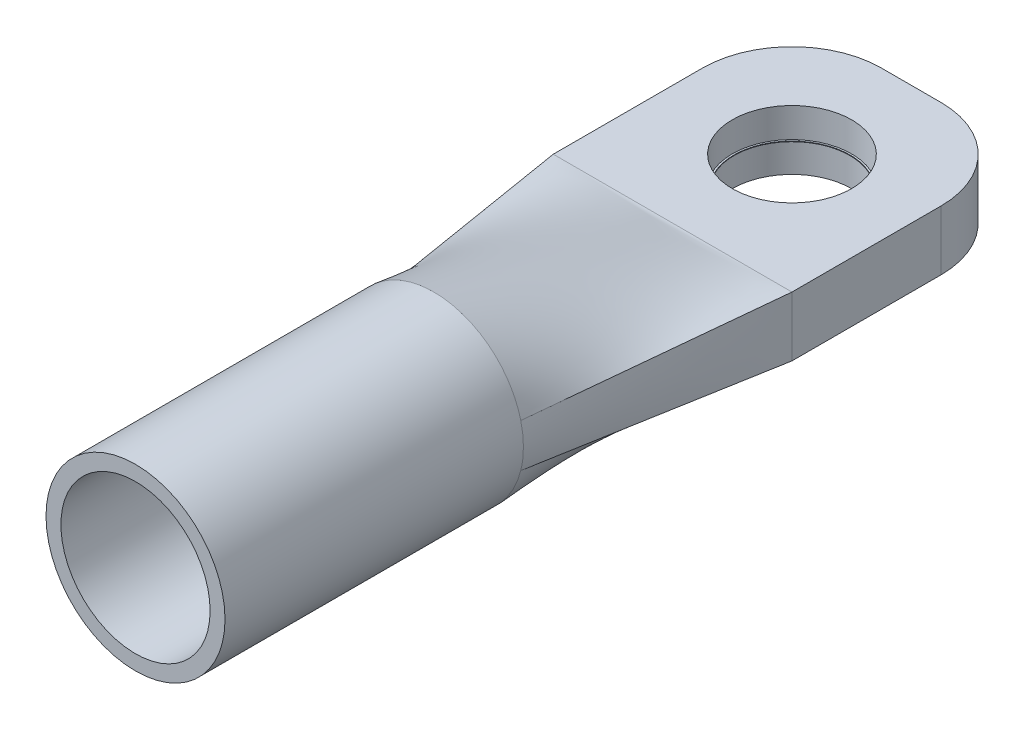
ISO-10303-21;
HEADER;
FILE_DESCRIPTION(('STEP AP214'),'2;1');
FILE_NAME('part.step','',(''),(''),'','','');
FILE_SCHEMA(('AUTOMOTIVE_DESIGN { 1 0 10303 214 1 1 1 1 }'));
ENDSEC;
DATA;
#1=APPLICATION_CONTEXT('core data for automotive mechanical design processes');
#2=APPLICATION_PROTOCOL_DEFINITION('international standard','automotive_design',2000,#1);
#3=PRODUCT_CONTEXT('',#1,'mechanical');
#4=PRODUCT('Part','Part','',(#3));
#5=PRODUCT_RELATED_PRODUCT_CATEGORY('part','',(#4));
#6=PRODUCT_DEFINITION_FORMATION('','',#4);
#7=PRODUCT_DEFINITION_CONTEXT('part definition',#1,'design');
#8=PRODUCT_DEFINITION('design','',#6,#7);
#9=PRODUCT_DEFINITION_SHAPE('','',#8);
#10=(LENGTH_UNIT() NAMED_UNIT(*) SI_UNIT(.MILLI.,.METRE.));
#11=(NAMED_UNIT(*) PLANE_ANGLE_UNIT() SI_UNIT($,.RADIAN.));
#12=(NAMED_UNIT(*) SI_UNIT($,.STERADIAN.) SOLID_ANGLE_UNIT());
#13=UNCERTAINTY_MEASURE_WITH_UNIT(LENGTH_MEASURE(1.E-05),#10,'distance_accuracy_value','');
#14=(GEOMETRIC_REPRESENTATION_CONTEXT(3) GLOBAL_UNCERTAINTY_ASSIGNED_CONTEXT((#13)) GLOBAL_UNIT_ASSIGNED_CONTEXT((#10,
#11,#12)) REPRESENTATION_CONTEXT('',''));
#15=CARTESIAN_POINT('',(0.,0.,0.));
#16=DIRECTION('',(0.,0.,1.));
#17=DIRECTION('',(1.,0.,0.));
#18=AXIS2_PLACEMENT_3D('',#15,#16,#17);
#19=CARTESIAN_POINT('',(0.,-11.,-12.));
#20=DIRECTION('',(0.,1.,0.));
#21=DIRECTION('',(-1.,0.,0.));
#22=AXIS2_PLACEMENT_3D('',#19,#20,#21);
#23=CYLINDRICAL_SURFACE('',#22,2.);
#24=CARTESIAN_POINT('',(0.,-0.999999999999999,-12.));
#25=DIRECTION('',(0.,1.,0.));
#26=DIRECTION('',(-1.,0.,0.));
#27=AXIS2_PLACEMENT_3D('',#24,#25,#26);
#28=CIRCLE('',#27,2.);
#29=CARTESIAN_POINT('',(-2.,-0.999999999999999,-12.));
#30=VERTEX_POINT('',#29);
#31=EDGE_CURVE('E414',#30,#30,#28,.T.);
#32=ORIENTED_EDGE('',*,*,#31,.F.);
#33=EDGE_LOOP('',(#32));
#34=FACE_BOUND('',#33,.T.);
#35=CARTESIAN_POINT('',(0.,-0.00999999999999959,-12.));
#36=DIRECTION('',(0.,1.,0.));
#37=DIRECTION('',(0.,0.,1.));
#38=AXIS2_PLACEMENT_3D('',#35,#36,#37);
#39=CIRCLE('',#38,2.);
#40=CARTESIAN_POINT('',(0.,-0.00999999999999959,-10.));
#41=VERTEX_POINT('',#40);
#42=EDGE_CURVE('E12',#41,#41,#39,.F.);
#43=ORIENTED_EDGE('',*,*,#42,.F.);
#44=EDGE_LOOP('',(#43));
#45=FACE_BOUND('',#44,.T.);
#46=ADVANCED_FACE('F64',(#34,#45),#23,.F.);
#47=CARTESIAN_POINT('',(0.,0.,10.));
#48=DIRECTION('',(0.,0.,1.));
#49=DIRECTION('',(1.,0.,0.));
#50=AXIS2_PLACEMENT_3D('',#47,#48,#49);
#51=PLANE('',#50);
#52=CARTESIAN_POINT('',(0.,0.,10.));
#53=DIRECTION('',(0.,0.,1.));
#54=DIRECTION('',(1.,0.,0.));
#55=AXIS2_PLACEMENT_3D('',#52,#53,#54);
#56=CIRCLE('',#55,3.);
#57=CARTESIAN_POINT('',(3.,0.,10.));
#58=VERTEX_POINT('',#57);
#59=EDGE_CURVE('E303',#58,#58,#56,.T.);
#60=ORIENTED_EDGE('',*,*,#59,.T.);
#61=EDGE_LOOP('',(#60));
#62=FACE_BOUND('',#61,.T.);
#63=CARTESIAN_POINT('',(0.,0.,10.));
#64=DIRECTION('',(0.,0.,1.));
#65=DIRECTION('',(1.,0.,0.));
#66=AXIS2_PLACEMENT_3D('',#63,#64,#65);
#67=CIRCLE('',#66,2.5);
#68=CARTESIAN_POINT('',(2.5,0.,10.));
#69=VERTEX_POINT('',#68);
#70=EDGE_CURVE('E304',#69,#69,#67,.T.);
#71=ORIENTED_EDGE('',*,*,#70,.F.);
#72=EDGE_LOOP('',(#71));
#73=FACE_BOUND('',#72,.T.);
#74=ADVANCED_FACE('F321',(#62,#73),#51,.T.);
#75=CARTESIAN_POINT('',(0.,0.,10.));
#76=DIRECTION('',(0.,0.,-1.));
#77=DIRECTION('',(-1.,0.,0.));
#78=AXIS2_PLACEMENT_3D('',#75,#76,#77);
#79=CYLINDRICAL_SURFACE('',#78,3.);
#80=ORIENTED_EDGE('',*,*,#59,.F.);
#81=EDGE_LOOP('',(#80));
#82=FACE_BOUND('',#81,.T.);
#83=CARTESIAN_POINT('',(-2.910427500436,0.727606875108999,0.));
#84=CARTESIAN_POINT('',(-2.85160397102423,0.962900992756057,0.));
#85=CARTESIAN_POINT('',(-2.75857854698862,1.21439415370098,0.));
#86=CARTESIAN_POINT('',(-2.47409174507778,1.72144671639495,0.));
#87=CARTESIAN_POINT('',(-2.28172040904308,1.97699530056574,0.));
#88=CARTESIAN_POINT('',(-1.7834014666696,2.43602907457679,0.));
#89=CARTESIAN_POINT('',(-1.47663557905439,2.6383647433975,0.));
#90=CARTESIAN_POINT('',(-0.77972465175108,2.92120704846197,0.));
#91=CARTESIAN_POINT('',(-0.390388203202208,3.,0.));
#92=CARTESIAN_POINT('',(0.390388203202207,3.,0.));
#93=CARTESIAN_POINT('',(0.779724651751079,2.92120704846197,0.));
#94=CARTESIAN_POINT('',(1.47663557905439,2.6383647433975,0.));
#95=CARTESIAN_POINT('',(1.7834014666696,2.43602907457679,0.));
#96=CARTESIAN_POINT('',(2.28172040904308,1.97699530056574,0.));
#97=CARTESIAN_POINT('',(2.47409174507778,1.72144671639495,0.));
#98=CARTESIAN_POINT('',(2.75857854698862,1.21439415370098,0.));
#99=CARTESIAN_POINT('',(2.85160397102423,0.962900992756059,0.));
#100=CARTESIAN_POINT('',(2.910427500436,0.727606875109,0.));
#101=B_SPLINE_CURVE_WITH_KNOTS('',3,(#83,#84,#85,#86,#87,#88,#89,#90,#91,#92,#93,#94,#95,#96,
#97,#98,#99,#100),.UNSPECIFIED.,.F.,.F.,(4,2,2,2,2,2,2,2,4),(0.,0.125,0.25,0.375,0.5,0.625,0.75,
0.875,1.),.UNSPECIFIED.);
#102=CARTESIAN_POINT('',(2.91070314872848,0.727676380171067,0.));
#103=VERTEX_POINT('',#102);
#104=CARTESIAN_POINT('',(-2.91066198008938,0.727665982522722,0.));
#105=VERTEX_POINT('',#104);
#106=EDGE_CURVE('E292',#103,#105,#101,.F.);
#107=ORIENTED_EDGE('',*,*,#106,.T.);
#108=CARTESIAN_POINT('',(-2.91042739863378,-0.727607282317932,0.));
#109=CARTESIAN_POINT('',(-2.92058190803545,-0.686991308106034,-9.56277897994739E-06));
#110=CARTESIAN_POINT('',(-2.92988512220104,-0.646163021880413,-9.53305452597186E-05));
#111=CARTESIAN_POINT('',(-2.94677515881051,-0.564152615284872,-0.000305231485093217));
#112=CARTESIAN_POINT('',(-2.95436196445463,-0.52297049145578,-0.000429365034132727));
#113=CARTESIAN_POINT('',(-2.96780392302818,-0.440331746256877,-0.000601932138829237));
#114=CARTESIAN_POINT('',(-2.97365940040851,-0.398875177808655,-0.00065037988530364));
#115=CARTESIAN_POINT('',(-2.98363041852755,-0.31575620492692,-0.000641221826432727));
#116=CARTESIAN_POINT('',(-2.98774598053489,-0.274093803015801,-0.00058361731751055));
#117=CARTESIAN_POINT('',(-2.99714999779004,-0.15303555095412,-0.000307918498571046));
#118=CARTESIAN_POINT('',(-3.00015627123046,-0.0734511317879126,7.99502166524376E-06));
#119=CARTESIAN_POINT('',(-2.99983121789374,0.0857039010614964,-9.42112577476832E-06));
#120=CARTESIAN_POINT('',(-2.99649997447853,0.165274514912521,-0.00034274225360069));
#121=CARTESIAN_POINT('',(-2.98668495083652,0.28527546173818,-0.000603420526766219));
#122=CARTESIAN_POINT('',(-2.98252448728023,0.325907634252367,-0.000649402771570797));
#123=CARTESIAN_POINT('',(-2.97254807319527,0.406970800050608,-0.000642669386041327));
#124=CARTESIAN_POINT('',(-2.96673211203271,0.447401792040704,-0.000589953121716436));
#125=CARTESIAN_POINT('',(-2.95345328714392,0.527998043620631,-0.00041575536854138));
#126=CARTESIAN_POINT('',(-2.94599017045876,0.568163261417772,-0.000294263313083601));
#127=CARTESIAN_POINT('',(-2.9294305629857,0.648155448873646,-9.06092480433311E-05));
#128=CARTESIAN_POINT('',(-2.92033407973027,0.687982420091357,-8.4470570925963E-06));
#129=CARTESIAN_POINT('',(-2.91042738573925,0.727607333895975,0.));
#130=B_SPLINE_CURVE_WITH_KNOTS('',3,(#108,#109,#110,#111,#112,#113,#114,#115,#116,#117,#118,
#119,#120,#121,#122,#123,#124,#125,#126,#127,#128,#129),.UNSPECIFIED.,.F.,.F.,(4,2,2,2,2,2,2,2,
2,2,4),(0.,0.12558830692637,0.251177843023987,0.37674382870519,0.502308279430179,
0.740964886546033,0.979618354461046,1.10212356724782,1.22462956695073,1.34715439339873,
1.46967865482249),.UNSPECIFIED.);
#131=CARTESIAN_POINT('',(-2.91067462409338,-0.727669088719532,0.));
#132=VERTEX_POINT('',#131);
#133=EDGE_CURVE('E293',#132,#105,#130,.T.);
#134=ORIENTED_EDGE('',*,*,#133,.F.);
#135=CARTESIAN_POINT('',(0.,0.,0.));
#136=DIRECTION('',(0.,0.,-1.));
#137=DIRECTION('',(-1.,0.,0.));
#138=AXIS2_PLACEMENT_3D('',#135,#136,#137);
#139=CIRCLE('',#138,3.);
#140=CARTESIAN_POINT('',(2.91063349538932,-0.727658719742583,0.));
#141=VERTEX_POINT('',#140);
#142=EDGE_CURVE('E167',#141,#132,#139,.T.);
#143=ORIENTED_EDGE('',*,*,#142,.F.);
#144=CARTESIAN_POINT('',(2.91042736092241,0.727607433163462,0.));
#145=CARTESIAN_POINT('',(2.92058187242539,0.686991459492907,-9.56253952613231E-06));
#146=CARTESIAN_POINT('',(2.9298850887039,0.646163173764886,-9.53301856414635E-05));
#147=CARTESIAN_POINT('',(2.94677512955884,0.564152768075831,-0.000305231045347849));
#148=CARTESIAN_POINT('',(2.95436193733552,0.522970644655621,-0.000429364634426509));
#149=CARTESIAN_POINT('',(2.96780390018986,0.440331900184076,-0.000601931901011317));
#150=CARTESIAN_POINT('',(2.97365937971838,0.398875332054339,-0.000650379769317828));
#151=CARTESIAN_POINT('',(2.98363040214575,0.315756359719126,-0.00064122197813699));
#152=CARTESIAN_POINT('',(2.98774596631323,0.274093958036047,-0.000583617615072778));
#153=CARTESIAN_POINT('',(2.99714998996238,0.153035705017171,-0.000307918938005094));
#154=CARTESIAN_POINT('',(3.00015626752966,0.0734512845378671,7.99484152029383E-06));
#155=CARTESIAN_POINT('',(2.99983122221239,-0.0857037512590697,-9.42087577406281E-06));
#156=CARTESIAN_POINT('',(2.99649998268971,-0.165274366744521,-0.00034274183274944));
#157=CARTESIAN_POINT('',(2.98668496473888,-0.285275316301503,-0.000603420280878621));
#158=CARTESIAN_POINT('',(2.982524503075,-0.325907489806919,-0.000649402660471402));
#159=CARTESIAN_POINT('',(2.97254809270084,-0.406970657659824,-0.000642669515495966));
#160=CARTESIAN_POINT('',(2.96673213335667,-0.447401650713356,-0.000589953356937291));
#161=CARTESIAN_POINT('',(2.95345331202817,-0.5279979044874,-0.000415755737415706));
#162=CARTESIAN_POINT('',(2.94599019708489,-0.568163123415236,-0.000294263709833493));
#163=CARTESIAN_POINT('',(2.92943059301641,-0.64815531319555,-9.06095637408823E-05));
#164=CARTESIAN_POINT('',(2.92033411142368,-0.687982285607005,-8.44726386319489E-06));
#165=CARTESIAN_POINT('',(2.91042741905463,-0.72760720063446,0.));
#166=B_SPLINE_CURVE_WITH_KNOTS('',3,(#144,#145,#146,#147,#148,#149,#150,#151,#152,#153,#154,
#155,#156,#157,#158,#159,#160,#161,#162,#163,#164,#165),.UNSPECIFIED.,.F.,.F.,(4,2,2,2,2,2,2,2,
2,2,4),(0.,0.125588306878624,0.251177842929332,0.376743828566451,0.50230827924701,
0.740964890753946,0.97961836306262,1.10212357822843,1.22462958030969,1.3471544091359,
1.46967867293886),.UNSPECIFIED.);
#167=EDGE_CURVE('E302',#103,#141,#166,.T.);
#168=ORIENTED_EDGE('',*,*,#167,.F.);
#169=EDGE_LOOP('',(#107,#134,#143,#168));
#170=FACE_BOUND('',#169,.T.);
#171=ADVANCED_FACE('F301',(#82,#170),#79,.T.);
#172=CARTESIAN_POINT('',(0.,0.,10.));
#173=DIRECTION('',(0.,0.,-1.));
#174=DIRECTION('',(-1.,0.,0.));
#175=AXIS2_PLACEMENT_3D('',#172,#173,#174);
#176=CYLINDRICAL_SURFACE('',#175,2.5);
#177=ORIENTED_EDGE('',*,*,#70,.T.);
#178=EDGE_LOOP('',(#177));
#179=FACE_BOUND('',#178,.T.);
#180=CARTESIAN_POINT('',(0.,0.,0.));
#181=DIRECTION('',(0.,0.,1.));
#182=DIRECTION('',(1.,0.,0.));
#183=AXIS2_PLACEMENT_3D('',#180,#181,#182);
#184=CIRCLE('',#183,2.5);
#185=CARTESIAN_POINT('',(2.5,0.,0.));
#186=VERTEX_POINT('',#185);
#187=EDGE_CURVE('E333',#186,#186,#184,.T.);
#188=ORIENTED_EDGE('',*,*,#187,.F.);
#189=EDGE_LOOP('',(#188));
#190=FACE_BOUND('',#189,.T.);
#191=ADVANCED_FACE('F196',(#179,#190),#176,.F.);
#192=CARTESIAN_POINT('',(0.,0.,0.));
#193=DIRECTION('',(0.,0.,-1.));
#194=DIRECTION('',(-1.,0.,0.));
#195=AXIS2_PLACEMENT_3D('',#192,#193,#194);
#196=PLANE('',#195);
#197=ORIENTED_EDGE('',*,*,#187,.T.);
#198=EDGE_LOOP('',(#197));
#199=FACE_BOUND('',#198,.T.);
#200=ADVANCED_FACE('F240',(#199),#196,.F.);
#201=CARTESIAN_POINT('',(-2.910427500436,0.727606875108999,0.));
#202=CARTESIAN_POINT('',(-4.,1.,-8.));
#203=CARTESIAN_POINT('',(-2.85160397102423,0.962900992756057,0.));
#204=CARTESIAN_POINT('',(-3.66666666666666,1.,-8.));
#205=CARTESIAN_POINT('',(-2.75857854698862,1.21439415370098,0.));
#206=CARTESIAN_POINT('',(-3.33333333333333,1.,-8.));
#207=CARTESIAN_POINT('',(-2.47409174507778,1.72144671639495,0.));
#208=CARTESIAN_POINT('',(-2.66666666666666,1.,-8.));
#209=CARTESIAN_POINT('',(-2.28172040904308,1.97699530056574,0.));
#210=CARTESIAN_POINT('',(-2.33333333333333,1.,-8.));
#211=CARTESIAN_POINT('',(-1.7834014666696,2.43602907457679,0.));
#212=CARTESIAN_POINT('',(-1.66666666666666,1.,-8.));
#213=CARTESIAN_POINT('',(-1.47663557905439,2.6383647433975,0.));
#214=CARTESIAN_POINT('',(-1.33333333333333,1.,-8.));
#215=CARTESIAN_POINT('',(-0.77972465175108,2.92120704846197,0.));
#216=CARTESIAN_POINT('',(-0.666666666666662,1.,-8.));
#217=CARTESIAN_POINT('',(-0.390388203202208,3.,0.));
#218=CARTESIAN_POINT('',(-0.333333333333329,1.,-8.));
#219=CARTESIAN_POINT('',(0.390388203202207,3.,0.));
#220=CARTESIAN_POINT('',(0.333333333333338,1.,-8.));
#221=CARTESIAN_POINT('',(0.779724651751079,2.92120704846197,0.));
#222=CARTESIAN_POINT('',(0.666666666666671,1.,-8.));
#223=CARTESIAN_POINT('',(1.47663557905439,2.6383647433975,0.));
#224=CARTESIAN_POINT('',(1.33333333333334,1.,-8.));
#225=CARTESIAN_POINT('',(1.7834014666696,2.43602907457679,0.));
#226=CARTESIAN_POINT('',(1.66666666666667,1.,-8.));
#227=CARTESIAN_POINT('',(2.28172040904308,1.97699530056574,0.));
#228=CARTESIAN_POINT('',(2.33333333333334,1.,-8.));
#229=CARTESIAN_POINT('',(2.47409174507778,1.72144671639495,0.));
#230=CARTESIAN_POINT('',(2.66666666666667,1.,-8.));
#231=CARTESIAN_POINT('',(2.75857854698862,1.21439415370098,0.));
#232=CARTESIAN_POINT('',(3.33333333333333,1.,-8.));
#233=CARTESIAN_POINT('',(2.85160397102423,0.962900992756059,0.));
#234=CARTESIAN_POINT('',(3.66666666666667,1.,-8.));
#235=CARTESIAN_POINT('',(2.910427500436,0.727606875109,0.));
#236=CARTESIAN_POINT('',(4.,1.,-8.));
#237=B_SPLINE_SURFACE_WITH_KNOTS('',3,1,((#201,#202),(#203,#204),(#205,#206),(#207,#208),(#209,
#210),(#211,#212),(#213,#214),(#215,#216),(#217,#218),(#219,#220),(#221,#222),(#223,#224),(#225,
#226),(#227,#228),(#229,#230),(#231,#232),(#233,#234),(#235,#236)),.UNSPECIFIED.,.F.,.F.,.F.,(4,
2,2,2,2,2,2,2,4),(2,2),(0.,0.125,0.25,0.375,0.5,0.625,0.75,0.875,1.),(0.,1.),.UNSPECIFIED.);
#238=DIRECTION('',(0.134873942488329,0.0337184856220823,-0.990288888842548));
#239=VECTOR('',#238,1.);
#240=CARTESIAN_POINT('',(3.455213750218,0.8638034375545,-4.));
#241=LINE('',#240,#239);
#242=CARTESIAN_POINT('',(4.,0.999999999999999,-8.));
#243=VERTEX_POINT('',#242);
#244=EDGE_CURVE('E288',#103,#243,#241,.T.);
#245=DIRECTION('',(-1.,0.,0.));
#246=VECTOR('',#245,1.);
#247=CARTESIAN_POINT('',(4.,1.,-8.));
#248=LINE('',#247,#246);
#249=CARTESIAN_POINT('',(-4.,1.,-8.));
#250=VERTEX_POINT('',#249);
#251=EDGE_CURVE('E170',#243,#250,#248,.T.);
#252=DIRECTION('',(0.134873942488329,-0.0337184856220823,0.990288888842548));
#253=VECTOR('',#252,1.);
#254=CARTESIAN_POINT('',(-3.455213750218,0.863803437554499,-4.));
#255=LINE('',#254,#253);
#256=EDGE_CURVE('E160',#250,#105,#255,.T.);
#257=ORIENTED_EDGE('',*,*,#106,.F.);
#258=ORIENTED_EDGE('',*,*,#244,.T.);
#259=ORIENTED_EDGE('',*,*,#251,.T.);
#260=ORIENTED_EDGE('',*,*,#256,.T.);
#261=EDGE_LOOP('',(#257,#258,#259,#260));
#262=FACE_BOUND('',#261,.T.);
#263=ADVANCED_FACE('F243',(#262),#237,.T.);
#264=CARTESIAN_POINT('',(2.90689808867129,0.741724522167823,0.));
#265=CARTESIAN_POINT('',(4.,1.02,-8.));
#266=CARTESIAN_POINT('',(2.90807455925953,0.737018639814882,0.));
#267=CARTESIAN_POINT('',(4.,1.01333333333333,-8.));
#268=CARTESIAN_POINT('',(2.90925102984776,0.732312757461941,0.));
#269=CARTESIAN_POINT('',(4.,1.00666666666667,-8.));
#270=CARTESIAN_POINT('',(2.910427500436,0.727606875109,0.));
#271=CARTESIAN_POINT('',(4.,1.,-8.));
#272=CARTESIAN_POINT('',(2.96925102984776,0.492312757461941,0.));
#273=CARTESIAN_POINT('',(4.,0.666666666666667,-8.));
#274=CARTESIAN_POINT('',(3.,0.246211251235322,0.));
#275=CARTESIAN_POINT('',(4.,0.333333333333334,-8.));
#276=CARTESIAN_POINT('',(3.,-0.24621125123532,0.));
#277=CARTESIAN_POINT('',(4.,-0.333333333333333,-8.));
#278=CARTESIAN_POINT('',(2.96925102984776,-0.492312757461939,0.));
#279=CARTESIAN_POINT('',(4.,-0.666666666666666,-8.));
#280=CARTESIAN_POINT('',(2.910427500436,-0.727606875108998,0.));
#281=CARTESIAN_POINT('',(4.,-1.,-8.));
#282=CARTESIAN_POINT('',(2.90925102984776,-0.732312757461939,0.));
#283=CARTESIAN_POINT('',(4.,-1.00666666666667,-8.));
#284=CARTESIAN_POINT('',(2.90807455925953,-0.73701863981488,0.));
#285=CARTESIAN_POINT('',(4.,-1.01333333333333,-8.));
#286=CARTESIAN_POINT('',(2.90689808867129,-0.741724522167821,0.));
#287=CARTESIAN_POINT('',(4.,-1.02,-8.));
#288=B_SPLINE_SURFACE_WITH_KNOTS('',3,1,((#264,#265),(#266,#267),(#268,#269),(#270,#271),(#272,
#273),(#274,#275),(#276,#277),(#278,#279),(#280,#281),(#282,#283),(#284,#285),(#286,#287)),
.UNSPECIFIED.,.F.,.F.,.F.,(4,3,2,3,4),(2,2),(-0.01,0.,0.5,1.,1.01),(0.,1.),.UNSPECIFIED.);
#289=DIRECTION('',(0.134873942488329,-0.0337184856220825,-0.990288888842548));
#290=VECTOR('',#289,1.);
#291=CARTESIAN_POINT('',(3.455213750218,-0.863803437554499,-4.));
#292=LINE('',#291,#290);
#293=CARTESIAN_POINT('',(4.,-1.,-8.));
#294=VERTEX_POINT('',#293);
#295=EDGE_CURVE('E169',#141,#294,#292,.T.);
#296=DIRECTION('',(0.,1.,0.));
#297=VECTOR('',#296,1.);
#298=CARTESIAN_POINT('',(4.,1.,-8.));
#299=LINE('',#298,#297);
#300=EDGE_CURVE('E149',#294,#243,#299,.T.);
#301=ORIENTED_EDGE('',*,*,#167,.T.);
#302=ORIENTED_EDGE('',*,*,#295,.T.);
#303=ORIENTED_EDGE('',*,*,#300,.T.);
#304=ORIENTED_EDGE('',*,*,#244,.F.);
#305=EDGE_LOOP('',(#301,#302,#303,#304));
#306=FACE_BOUND('',#305,.T.);
#307=ADVANCED_FACE('F249',(#306),#288,.T.);
#308=CARTESIAN_POINT('',(-2.90689808867129,-0.741724522167823,0.));
#309=CARTESIAN_POINT('',(-4.,-1.02,-8.));
#310=CARTESIAN_POINT('',(-2.90807455925952,-0.737018639814882,0.));
#311=CARTESIAN_POINT('',(-4.,-1.01333333333333,-8.));
#312=CARTESIAN_POINT('',(-2.90925102984776,-0.732312757461941,0.));
#313=CARTESIAN_POINT('',(-4.,-1.00666666666667,-8.));
#314=CARTESIAN_POINT('',(-2.910427500436,-0.727606875109,0.));
#315=CARTESIAN_POINT('',(-4.,-1.,-8.));
#316=CARTESIAN_POINT('',(-2.96925102984776,-0.492312757461941,0.));
#317=CARTESIAN_POINT('',(-4.,-0.666666666666667,-8.));
#318=CARTESIAN_POINT('',(-3.,-0.246211251235322,0.));
#319=CARTESIAN_POINT('',(-4.,-0.333333333333334,-8.));
#320=CARTESIAN_POINT('',(-3.,0.246211251235321,0.));
#321=CARTESIAN_POINT('',(-4.,0.333333333333333,-8.));
#322=CARTESIAN_POINT('',(-2.96925102984776,0.49231275746194,0.));
#323=CARTESIAN_POINT('',(-4.,0.666666666666666,-8.));
#324=CARTESIAN_POINT('',(-2.910427500436,0.727606875108999,0.));
#325=CARTESIAN_POINT('',(-4.,1.,-8.));
#326=CARTESIAN_POINT('',(-2.90925102984776,0.732312757461941,0.));
#327=CARTESIAN_POINT('',(-4.,1.00666666666667,-8.));
#328=CARTESIAN_POINT('',(-2.90807455925953,0.737018639814882,0.));
#329=CARTESIAN_POINT('',(-4.,1.01333333333333,-8.));
#330=CARTESIAN_POINT('',(-2.90689808867129,0.741724522167823,0.));
#331=CARTESIAN_POINT('',(-4.,1.02,-8.));
#332=B_SPLINE_SURFACE_WITH_KNOTS('',3,1,((#308,#309),(#310,#311),(#312,#313),(#314,#315),(#316,
#317),(#318,#319),(#320,#321),(#322,#323),(#324,#325),(#326,#327),(#328,#329),(#330,#331)),
.UNSPECIFIED.,.F.,.F.,.F.,(4,3,2,3,4),(2,2),(-0.01,0.,0.5,1.,1.01),(0.,1.),.UNSPECIFIED.);
#333=DIRECTION('',(0.,-1.,0.));
#334=VECTOR('',#333,1.);
#335=CARTESIAN_POINT('',(-4.,1.,-8.));
#336=LINE('',#335,#334);
#337=CARTESIAN_POINT('',(-4.,-1.,-8.));
#338=VERTEX_POINT('',#337);
#339=EDGE_CURVE('E132',#250,#338,#336,.T.);
#340=DIRECTION('',(-0.134873942488329,-0.0337184856220824,-0.990288888842548));
#341=VECTOR('',#340,1.);
#342=CARTESIAN_POINT('',(-3.455213750218,-0.8638034375545,-4.));
#343=LINE('',#342,#341);
#344=EDGE_CURVE('E157',#132,#338,#343,.T.);
#345=ORIENTED_EDGE('',*,*,#133,.T.);
#346=ORIENTED_EDGE('',*,*,#256,.F.);
#347=ORIENTED_EDGE('',*,*,#339,.T.);
#348=ORIENTED_EDGE('',*,*,#344,.F.);
#349=EDGE_LOOP('',(#345,#346,#347,#348));
#350=FACE_BOUND('',#349,.T.);
#351=ADVANCED_FACE('F156',(#350),#332,.T.);
#352=CARTESIAN_POINT('',(2.910427500436,-0.727606875108998,0.));
#353=CARTESIAN_POINT('',(4.,-1.,-8.));
#354=CARTESIAN_POINT('',(2.85160397102423,-0.962900992756056,0.));
#355=CARTESIAN_POINT('',(3.66666666666667,-1.,-8.));
#356=CARTESIAN_POINT('',(2.75857854698862,-1.21439415370098,0.));
#357=CARTESIAN_POINT('',(3.33333333333333,-1.,-8.));
#358=CARTESIAN_POINT('',(2.47409174507778,-1.72144671639495,0.));
#359=CARTESIAN_POINT('',(2.66666666666666,-1.,-8.));
#360=CARTESIAN_POINT('',(2.28172040904308,-1.97699530056574,0.));
#361=CARTESIAN_POINT('',(2.33333333333333,-1.,-8.));
#362=CARTESIAN_POINT('',(1.7834014666696,-2.43602907457679,0.));
#363=CARTESIAN_POINT('',(1.66666666666666,-1.,-8.));
#364=CARTESIAN_POINT('',(1.47663557905439,-2.6383647433975,0.));
#365=CARTESIAN_POINT('',(1.33333333333333,-1.,-8.));
#366=CARTESIAN_POINT('',(0.779724651751081,-2.92120704846197,0.));
#367=CARTESIAN_POINT('',(0.666666666666664,-1.,-8.));
#368=CARTESIAN_POINT('',(0.390388203202209,-3.,0.));
#369=CARTESIAN_POINT('',(0.333333333333331,-1.,-8.));
#370=CARTESIAN_POINT('',(-0.390388203202206,-3.,0.));
#371=CARTESIAN_POINT('',(-0.333333333333336,-1.,-8.));
#372=CARTESIAN_POINT('',(-0.779724651751078,-2.92120704846197,0.));
#373=CARTESIAN_POINT('',(-0.66666666666667,-1.,-8.));
#374=CARTESIAN_POINT('',(-1.47663557905439,-2.6383647433975,0.));
#375=CARTESIAN_POINT('',(-1.33333333333334,-1.,-8.));
#376=CARTESIAN_POINT('',(-1.7834014666696,-2.43602907457679,0.));
#377=CARTESIAN_POINT('',(-1.66666666666667,-1.,-8.));
#378=CARTESIAN_POINT('',(-2.28172040904308,-1.97699530056574,0.));
#379=CARTESIAN_POINT('',(-2.33333333333333,-1.,-8.));
#380=CARTESIAN_POINT('',(-2.47409174507778,-1.72144671639495,0.));
#381=CARTESIAN_POINT('',(-2.66666666666667,-1.,-8.));
#382=CARTESIAN_POINT('',(-2.75857854698862,-1.21439415370099,0.));
#383=CARTESIAN_POINT('',(-3.33333333333333,-1.,-8.));
#384=CARTESIAN_POINT('',(-2.85160397102423,-0.962900992756059,0.));
#385=CARTESIAN_POINT('',(-3.66666666666667,-1.,-8.));
#386=CARTESIAN_POINT('',(-2.910427500436,-0.727606875108999,0.));
#387=CARTESIAN_POINT('',(-4.,-1.,-8.));
#388=B_SPLINE_SURFACE_WITH_KNOTS('',3,1,((#352,#353),(#354,#355),(#356,#357),(#358,#359),(#360,
#361),(#362,#363),(#364,#365),(#366,#367),(#368,#369),(#370,#371),(#372,#373),(#374,#375),(#376,
#377),(#378,#379),(#380,#381),(#382,#383),(#384,#385),(#386,#387)),.UNSPECIFIED.,.F.,.F.,.F.,(4,
2,2,2,2,2,2,2,4),(2,2),(0.,0.125,0.25,0.375,0.5,0.625,0.75,0.875,1.),(0.,1.),.UNSPECIFIED.);
#389=DIRECTION('',(1.,0.,0.));
#390=VECTOR('',#389,1.);
#391=CARTESIAN_POINT('',(4.,-1.,-8.));
#392=LINE('',#391,#390);
#393=EDGE_CURVE('E140',#338,#294,#392,.T.);
#394=ORIENTED_EDGE('',*,*,#142,.T.);
#395=ORIENTED_EDGE('',*,*,#344,.T.);
#396=ORIENTED_EDGE('',*,*,#393,.T.);
#397=ORIENTED_EDGE('',*,*,#295,.F.);
#398=EDGE_LOOP('',(#394,#395,#396,#397));
#399=FACE_BOUND('',#398,.T.);
#400=ADVANCED_FACE('F165',(#399),#388,.T.);
#401=CARTESIAN_POINT('',(4.,0.999999999999999,-16.));
#402=DIRECTION('',(-1.,0.,0.));
#403=DIRECTION('',(0.,0.,1.));
#404=AXIS2_PLACEMENT_3D('',#401,#402,#403);
#405=PLANE('',#404);
#406=DIRECTION('',(0.,0.,1.));
#407=VECTOR('',#406,1.);
#408=CARTESIAN_POINT('',(4.,-1.,-16.));
#409=LINE('',#408,#407);
#410=CARTESIAN_POINT('',(4.,-1.,-13.));
#411=VERTEX_POINT('',#410);
#412=EDGE_CURVE('E136',#411,#294,#409,.T.);
#413=ORIENTED_EDGE('',*,*,#412,.F.);
#414=DIRECTION('',(0.,-1.,0.));
#415=VECTOR('',#414,1.);
#416=CARTESIAN_POINT('',(4.,0.999999999999999,-13.));
#417=LINE('',#416,#415);
#418=CARTESIAN_POINT('',(4.,0.999999999999999,-13.));
#419=VERTEX_POINT('',#418);
#420=EDGE_CURVE('E72',#411,#419,#417,.F.);
#421=ORIENTED_EDGE('',*,*,#420,.T.);
#422=DIRECTION('',(0.,0.,1.));
#423=VECTOR('',#422,1.);
#424=CARTESIAN_POINT('',(4.,0.999999999999999,-16.));
#425=LINE('',#424,#423);
#426=EDGE_CURVE('E346',#419,#243,#425,.T.);
#427=ORIENTED_EDGE('',*,*,#426,.T.);
#428=ORIENTED_EDGE('',*,*,#300,.F.);
#429=EDGE_LOOP('',(#413,#421,#427,#428));
#430=FACE_BOUND('',#429,.T.);
#431=ADVANCED_FACE('F191',(#430),#405,.F.);
#432=CARTESIAN_POINT('',(-4.,-1.,-16.));
#433=DIRECTION('',(0.,1.,0.));
#434=DIRECTION('',(-1.,0.,0.));
#435=AXIS2_PLACEMENT_3D('',#432,#433,#434);
#436=PLANE('',#435);
#437=ORIENTED_EDGE('',*,*,#31,.T.);
#438=EDGE_LOOP('',(#437));
#439=FACE_BOUND('',#438,.T.);
#440=DIRECTION('',(0.,0.,1.));
#441=VECTOR('',#440,1.);
#442=CARTESIAN_POINT('',(-4.,-1.,-16.));
#443=LINE('',#442,#441);
#444=CARTESIAN_POINT('',(-4.,-1.,-13.));
#445=VERTEX_POINT('',#444);
#446=EDGE_CURVE('E128',#445,#338,#443,.T.);
#447=ORIENTED_EDGE('',*,*,#446,.F.);
#448=CARTESIAN_POINT('',(-1.,-1.,-13.));
#449=DIRECTION('',(0.,1.,0.));
#450=DIRECTION('',(-1.,0.,0.));
#451=AXIS2_PLACEMENT_3D('',#448,#449,#450);
#452=CIRCLE('',#451,3.);
#453=CARTESIAN_POINT('',(-1.,-1.,-16.));
#454=VERTEX_POINT('',#453);
#455=EDGE_CURVE('E343',#445,#454,#452,.F.);
#456=ORIENTED_EDGE('',*,*,#455,.T.);
#457=DIRECTION('',(-1.,0.,0.));
#458=VECTOR('',#457,1.);
#459=CARTESIAN_POINT('',(-4.,-1.,-16.));
#460=LINE('',#459,#458);
#461=CARTESIAN_POINT('',(0.999999999999999,-1.,-16.));
#462=VERTEX_POINT('',#461);
#463=EDGE_CURVE('E418',#462,#454,#460,.T.);
#464=ORIENTED_EDGE('',*,*,#463,.F.);
#465=CARTESIAN_POINT('',(0.999999999999999,-1.,-13.));
#466=DIRECTION('',(0.,1.,0.));
#467=DIRECTION('',(-1.,0.,0.));
#468=AXIS2_PLACEMENT_3D('',#465,#466,#467);
#469=CIRCLE('',#468,3.);
#470=EDGE_CURVE('E79',#462,#411,#469,.F.);
#471=ORIENTED_EDGE('',*,*,#470,.T.);
#472=ORIENTED_EDGE('',*,*,#412,.T.);
#473=ORIENTED_EDGE('',*,*,#393,.F.);
#474=EDGE_LOOP('',(#447,#456,#464,#471,#472,#473));
#475=FACE_BOUND('',#474,.T.);
#476=ADVANCED_FACE('F142',(#439,#475),#436,.F.);
#477=CARTESIAN_POINT('',(-4.,1.,-16.));
#478=DIRECTION('',(1.,0.,0.));
#479=DIRECTION('',(0.,0.,-1.));
#480=AXIS2_PLACEMENT_3D('',#477,#478,#479);
#481=PLANE('',#480);
#482=DIRECTION('',(0.,0.,1.));
#483=VECTOR('',#482,1.);
#484=CARTESIAN_POINT('',(-4.,1.,-16.));
#485=LINE('',#484,#483);
#486=CARTESIAN_POINT('',(-4.,1.,-13.));
#487=VERTEX_POINT('',#486);
#488=EDGE_CURVE('E137',#487,#250,#485,.T.);
#489=ORIENTED_EDGE('',*,*,#488,.F.);
#490=DIRECTION('',(0.,1.,0.));
#491=VECTOR('',#490,1.);
#492=CARTESIAN_POINT('',(-4.,1.,-13.));
#493=LINE('',#492,#491);
#494=EDGE_CURVE('E87',#487,#445,#493,.F.);
#495=ORIENTED_EDGE('',*,*,#494,.T.);
#496=ORIENTED_EDGE('',*,*,#446,.T.);
#497=ORIENTED_EDGE('',*,*,#339,.F.);
#498=EDGE_LOOP('',(#489,#495,#496,#497));
#499=FACE_BOUND('',#498,.T.);
#500=ADVANCED_FACE('F130',(#499),#481,.F.);
#501=CARTESIAN_POINT('',(-4.,1.,-16.));
#502=DIRECTION('',(0.,-1.,0.));
#503=DIRECTION('',(1.,0.,0.));
#504=AXIS2_PLACEMENT_3D('',#501,#502,#503);
#505=PLANE('',#504);
#506=CARTESIAN_POINT('',(0.,1.,-12.));
#507=DIRECTION('',(0.,1.,0.));
#508=DIRECTION('',(-1.,0.,0.));
#509=AXIS2_PLACEMENT_3D('',#506,#507,#508);
#510=CIRCLE('',#509,2.);
#511=CARTESIAN_POINT('',(-2.,1.,-12.));
#512=VERTEX_POINT('',#511);
#513=EDGE_CURVE('E412',#512,#512,#510,.T.);
#514=ORIENTED_EDGE('',*,*,#513,.F.);
#515=EDGE_LOOP('',(#514));
#516=FACE_BOUND('',#515,.T.);
#517=DIRECTION('',(1.,0.,0.));
#518=VECTOR('',#517,1.);
#519=CARTESIAN_POINT('',(-4.,1.,-16.));
#520=LINE('',#519,#518);
#521=CARTESIAN_POINT('',(-1.,1.,-16.));
#522=VERTEX_POINT('',#521);
#523=CARTESIAN_POINT('',(0.999999999999999,1.,-16.));
#524=VERTEX_POINT('',#523);
#525=EDGE_CURVE('E355',#522,#524,#520,.T.);
#526=ORIENTED_EDGE('',*,*,#525,.F.);
#527=CARTESIAN_POINT('',(-1.,1.,-13.));
#528=DIRECTION('',(0.,-1.,0.));
#529=DIRECTION('',(1.,0.,0.));
#530=AXIS2_PLACEMENT_3D('',#527,#528,#529);
#531=CIRCLE('',#530,3.);
#532=EDGE_CURVE('E360',#522,#487,#531,.F.);
#533=ORIENTED_EDGE('',*,*,#532,.T.);
#534=ORIENTED_EDGE('',*,*,#488,.T.);
#535=ORIENTED_EDGE('',*,*,#251,.F.);
#536=ORIENTED_EDGE('',*,*,#426,.F.);
#537=CARTESIAN_POINT('',(0.999999999999999,1.,-13.));
#538=DIRECTION('',(0.,-1.,0.));
#539=DIRECTION('',(1.,0.,0.));
#540=AXIS2_PLACEMENT_3D('',#537,#538,#539);
#541=CIRCLE('',#540,3.);
#542=EDGE_CURVE('E352',#419,#524,#541,.F.);
#543=ORIENTED_EDGE('',*,*,#542,.T.);
#544=EDGE_LOOP('',(#526,#533,#534,#535,#536,#543));
#545=FACE_BOUND('',#544,.T.);
#546=ADVANCED_FACE('F351',(#516,#545),#505,.F.);
#547=CARTESIAN_POINT('',(0.,0.,-16.));
#548=DIRECTION('',(0.,0.,1.));
#549=DIRECTION('',(1.,0.,0.));
#550=AXIS2_PLACEMENT_3D('',#547,#548,#549);
#551=PLANE('',#550);
#552=ORIENTED_EDGE('',*,*,#463,.T.);
#553=DIRECTION('',(0.,1.,0.));
#554=VECTOR('',#553,1.);
#555=CARTESIAN_POINT('',(-1.,0.,-16.));
#556=LINE('',#555,#554);
#557=EDGE_CURVE('E361',#454,#522,#556,.T.);
#558=ORIENTED_EDGE('',*,*,#557,.T.);
#559=ORIENTED_EDGE('',*,*,#525,.T.);
#560=DIRECTION('',(0.,-1.,0.));
#561=VECTOR('',#560,1.);
#562=CARTESIAN_POINT('',(0.999999999999999,0.,-16.));
#563=LINE('',#562,#561);
#564=EDGE_CURVE('E359',#524,#462,#563,.T.);
#565=ORIENTED_EDGE('',*,*,#564,.T.);
#566=EDGE_LOOP('',(#552,#558,#559,#565));
#567=FACE_BOUND('',#566,.T.);
#568=ADVANCED_FACE('F429',(#567),#551,.F.);
#569=CARTESIAN_POINT('',(-1.,0.,-13.));
#570=DIRECTION('',(0.,1.,0.));
#571=DIRECTION('',(0.,0.,1.));
#572=AXIS2_PLACEMENT_3D('',#569,#570,#571);
#573=CYLINDRICAL_SURFACE('',#572,3.);
#574=ORIENTED_EDGE('',*,*,#455,.F.);
#575=ORIENTED_EDGE('',*,*,#494,.F.);
#576=ORIENTED_EDGE('',*,*,#532,.F.);
#577=ORIENTED_EDGE('',*,*,#557,.F.);
#578=EDGE_LOOP('',(#574,#575,#576,#577));
#579=FACE_BOUND('',#578,.T.);
#580=ADVANCED_FACE('F323',(#579),#573,.T.);
#581=CARTESIAN_POINT('',(0.999999999999999,0.,-13.));
#582=DIRECTION('',(0.,-1.,0.));
#583=DIRECTION('',(0.,0.,-1.));
#584=AXIS2_PLACEMENT_3D('',#581,#582,#583);
#585=CYLINDRICAL_SURFACE('',#584,3.);
#586=ORIENTED_EDGE('',*,*,#542,.F.);
#587=ORIENTED_EDGE('',*,*,#420,.F.);
#588=ORIENTED_EDGE('',*,*,#470,.F.);
#589=ORIENTED_EDGE('',*,*,#564,.F.);
#590=EDGE_LOOP('',(#586,#587,#588,#589));
#591=FACE_BOUND('',#590,.T.);
#592=ADVANCED_FACE('F66',(#591),#585,.T.);
#593=CARTESIAN_POINT('',(0.,0.01,-12.));
#594=DIRECTION('',(0.,1.,0.));
#595=DIRECTION('',(0.,0.,1.));
#596=AXIS2_PLACEMENT_3D('',#593,#594,#595);
#597=CIRCLE('',#596,2.);
#598=CARTESIAN_POINT('',(0.,0.01,-10.));
#599=VERTEX_POINT('',#598);
#600=EDGE_CURVE('E409',#599,#599,#597,.T.);
#601=ORIENTED_EDGE('',*,*,#600,.F.);
#602=EDGE_LOOP('',(#601));
#603=FACE_BOUND('',#602,.T.);
#604=ORIENTED_EDGE('',*,*,#513,.T.);
#605=EDGE_LOOP('',(#604));
#606=FACE_BOUND('',#605,.T.);
#607=ADVANCED_FACE('F388',(#603,#606),#23,.F.);
#608=CARTESIAN_POINT('',(0.,-0.01,-12.));
#609=DIRECTION('',(0.,1.,0.));
#610=DIRECTION('',(0.,0.,1.));
#611=AXIS2_PLACEMENT_3D('',#608,#609,#610);
#612=PLANE('',#611);
#613=CARTESIAN_POINT('',(0.,-0.01,-12.));
#614=DIRECTION('',(0.,1.,0.));
#615=DIRECTION('',(0.,0.,1.));
#616=AXIS2_PLACEMENT_3D('',#613,#614,#615);
#617=CIRCLE('',#616,1.94261234021432);
#618=CARTESIAN_POINT('',(0.,-0.01,-10.0573876597857));
#619=VERTEX_POINT('',#618);
#620=EDGE_CURVE('E415',#619,#619,#617,.T.);
#621=ORIENTED_EDGE('',*,*,#620,.T.);
#622=EDGE_LOOP('',(#621));
#623=FACE_BOUND('',#622,.T.);
#624=ORIENTED_EDGE('',*,*,#42,.T.);
#625=EDGE_LOOP('',(#624));
#626=FACE_BOUND('',#625,.T.);
#627=ADVANCED_FACE('F398',(#623,#626),#612,.F.);
#628=CARTESIAN_POINT('',(0.,-0.01,-12.));
#629=DIRECTION('',(0.,1.,0.));
#630=DIRECTION('',(0.,0.,1.));
#631=AXIS2_PLACEMENT_3D('',#628,#629,#630);
#632=CYLINDRICAL_SURFACE('',#631,1.94261234021432);
#633=CARTESIAN_POINT('',(0.,0.01,-12.));
#634=DIRECTION('',(0.,1.,0.));
#635=DIRECTION('',(0.,0.,1.));
#636=AXIS2_PLACEMENT_3D('',#633,#634,#635);
#637=CIRCLE('',#636,1.94261234021432);
#638=CARTESIAN_POINT('',(0.,0.01,-10.0573876597857));
#639=VERTEX_POINT('',#638);
#640=EDGE_CURVE('E580',#639,#639,#637,.T.);
#641=CARTESIAN_POINT('',(0.,-0.01,-10.0573876597857));
#642=CARTESIAN_POINT('',(0.,-0.00979166666666667,-10.0573876597857));
#643=CARTESIAN_POINT('',(0.,-0.00958333333333333,-10.0573876597857));
#644=CARTESIAN_POINT('',(0.,-0.00916666666666667,-10.0573876597857));
#645=CARTESIAN_POINT('',(0.,-0.00895833333333333,-10.0573876597857));
#646=CARTESIAN_POINT('',(0.,-0.00854166666666667,-10.0573876597857));
#647=CARTESIAN_POINT('',(0.,-0.00833333333333333,-10.0573876597857));
#648=CARTESIAN_POINT('',(0.,-0.00791666666666667,-10.0573876597857));
#649=CARTESIAN_POINT('',(0.,-0.00770833333333333,-10.0573876597857));
#650=CARTESIAN_POINT('',(0.,-0.00729166666666667,-10.0573876597857));
#651=CARTESIAN_POINT('',(0.,-0.00708333333333333,-10.0573876597857));
#652=CARTESIAN_POINT('',(0.,-0.00666666666666667,-10.0573876597857));
#653=CARTESIAN_POINT('',(0.,-0.00645833333333334,-10.0573876597857));
#654=CARTESIAN_POINT('',(0.,-0.00604166666666667,-10.0573876597857));
#655=CARTESIAN_POINT('',(0.,-0.00583333333333333,-10.0573876597857));
#656=CARTESIAN_POINT('',(0.,-0.00541666666666667,-10.0573876597857));
#657=CARTESIAN_POINT('',(0.,-0.00520833333333333,-10.0573876597857));
#658=CARTESIAN_POINT('',(0.,-0.00479166666666667,-10.0573876597857));
#659=CARTESIAN_POINT('',(0.,-0.00458333333333334,-10.0573876597857));
#660=CARTESIAN_POINT('',(0.,-0.00416666666666667,-10.0573876597857));
#661=CARTESIAN_POINT('',(0.,-0.00395833333333333,-10.0573876597857));
#662=CARTESIAN_POINT('',(0.,-0.00354166666666667,-10.0573876597857));
#663=CARTESIAN_POINT('',(0.,-0.00333333333333333,-10.0573876597857));
#664=CARTESIAN_POINT('',(0.,-0.00291666666666667,-10.0573876597857));
#665=CARTESIAN_POINT('',(0.,-0.00270833333333333,-10.0573876597857));
#666=CARTESIAN_POINT('',(0.,-0.00229166666666667,-10.0573876597857));
#667=CARTESIAN_POINT('',(0.,-0.00208333333333333,-10.0573876597857));
#668=CARTESIAN_POINT('',(0.,-0.00166666666666667,-10.0573876597857));
#669=CARTESIAN_POINT('',(0.,-0.00145833333333333,-10.0573876597857));
#670=CARTESIAN_POINT('',(0.,-0.00104166666666667,-10.0573876597857));
#671=CARTESIAN_POINT('',(0.,-0.000833333333333333,-10.0573876597857));
#672=CARTESIAN_POINT('',(0.,-0.000416666666666667,-10.0573876597857));
#673=CARTESIAN_POINT('',(0.,-0.000208333333333333,-10.0573876597857));
#674=CARTESIAN_POINT('',(0.,0.000208333333333333,-10.0573876597857));
#675=CARTESIAN_POINT('',(0.,0.000416666666666667,-10.0573876597857));
#676=CARTESIAN_POINT('',(0.,0.000833333333333333,-10.0573876597857));
#677=CARTESIAN_POINT('',(0.,0.00104166666666667,-10.0573876597857));
#678=CARTESIAN_POINT('',(0.,0.00145833333333333,-10.0573876597857));
#679=CARTESIAN_POINT('',(0.,0.00166666666666667,-10.0573876597857));
#680=CARTESIAN_POINT('',(0.,0.00208333333333333,-10.0573876597857));
#681=CARTESIAN_POINT('',(0.,0.00229166666666667,-10.0573876597857));
#682=CARTESIAN_POINT('',(0.,0.00270833333333333,-10.0573876597857));
#683=CARTESIAN_POINT('',(0.,0.00291666666666667,-10.0573876597857));
#684=CARTESIAN_POINT('',(0.,0.00333333333333333,-10.0573876597857));
#685=CARTESIAN_POINT('',(0.,0.00354166666666667,-10.0573876597857));
#686=CARTESIAN_POINT('',(0.,0.00395833333333333,-10.0573876597857));
#687=CARTESIAN_POINT('',(0.,0.00416666666666667,-10.0573876597857));
#688=CARTESIAN_POINT('',(0.,0.00458333333333334,-10.0573876597857));
#689=CARTESIAN_POINT('',(0.,0.00479166666666667,-10.0573876597857));
#690=CARTESIAN_POINT('',(0.,0.00520833333333333,-10.0573876597857));
#691=CARTESIAN_POINT('',(0.,0.00541666666666667,-10.0573876597857));
#692=CARTESIAN_POINT('',(0.,0.00583333333333333,-10.0573876597857));
#693=CARTESIAN_POINT('',(0.,0.00604166666666667,-10.0573876597857));
#694=CARTESIAN_POINT('',(0.,0.00645833333333333,-10.0573876597857));
#695=CARTESIAN_POINT('',(0.,0.00666666666666667,-10.0573876597857));
#696=CARTESIAN_POINT('',(0.,0.00708333333333333,-10.0573876597857));
#697=CARTESIAN_POINT('',(0.,0.00729166666666667,-10.0573876597857));
#698=CARTESIAN_POINT('',(0.,0.00770833333333333,-10.0573876597857));
#699=CARTESIAN_POINT('',(0.,0.00791666666666667,-10.0573876597857));
#700=CARTESIAN_POINT('',(0.,0.00833333333333333,-10.0573876597857));
#701=CARTESIAN_POINT('',(0.,0.00854166666666667,-10.0573876597857));
#702=CARTESIAN_POINT('',(0.,0.00895833333333333,-10.0573876597857));
#703=CARTESIAN_POINT('',(0.,0.00916666666666667,-10.0573876597857));
#704=CARTESIAN_POINT('',(0.,0.00958333333333333,-10.0573876597857));
#705=CARTESIAN_POINT('',(0.,0.00979166666666667,-10.0573876597857));
#706=CARTESIAN_POINT('',(0.,0.01,-10.0573876597857));
#707=B_SPLINE_CURVE_WITH_KNOTS('',3,(#641,#642,#643,#644,#645,#646,#647,#648,#649,#650,#651,
#652,#653,#654,#655,#656,#657,#658,#659,#660,#661,#662,#663,#664,#665,#666,#667,#668,#669,#670,
#671,#672,#673,#674,#675,#676,#677,#678,#679,#680,#681,#682,#683,#684,#685,#686,#687,#688,#689,
#690,#691,#692,#693,#694,#695,#696,#697,#698,#699,#700,#701,#702,#703,#704,#705,#706),
.UNSPECIFIED.,.F.,.F.,(4,2,2,2,2,2,2,2,2,2,2,2,2,2,2,2,2,2,2,2,2,2,2,2,2,2,2,2,2,2,2,2,4),(0.,
0.000625,0.00125,0.001875,0.0025,0.003125,0.00375,0.004375,0.005,0.005625,0.00625,0.006875,
0.0075,0.008125,0.00875,0.009375,0.01,0.010625,0.01125,0.011875,0.0125,0.013125,0.01375,
0.014375,0.015,0.015625,0.01625,0.016875,0.0175,0.018125,0.01875,0.019375,0.02),.UNSPECIFIED.);
#708=EDGE_CURVE('BSEAM404',#619,#639,#707,.T.);
#709=ORIENTED_EDGE('',*,*,#620,.F.);
#710=ORIENTED_EDGE('',*,*,#640,.T.);
#711=ORIENTED_EDGE('',*,*,#708,.T.);
#712=ORIENTED_EDGE('',*,*,#708,.F.);
#713=EDGE_LOOP('',(#709,#711,#710,#712));
#714=FACE_BOUND('',#713,.T.);
#715=ADVANCED_FACE('F404',(#714),#632,.F.);
#716=CARTESIAN_POINT('',(0.,0.01,-12.));
#717=DIRECTION('',(0.,1.,0.));
#718=DIRECTION('',(0.,0.,1.));
#719=AXIS2_PLACEMENT_3D('',#716,#717,#718);
#720=PLANE('',#719);
#721=ORIENTED_EDGE('',*,*,#600,.T.);
#722=EDGE_LOOP('',(#721));
#723=FACE_BOUND('',#722,.T.);
#724=ORIENTED_EDGE('',*,*,#640,.F.);
#725=EDGE_LOOP('',(#724));
#726=FACE_BOUND('',#725,.T.);
#727=ADVANCED_FACE('F563',(#723,#726),#720,.T.);
#728=CLOSED_SHELL('',(#46,#74,#171,#191,#200,#263,#307,#351,#400,#431,#476,#500,#546,#568,#580,
#592,#607,#627,#715,#727));
#729=MANIFOLD_SOLID_BREP('B2',#728);
#730=ADVANCED_BREP_SHAPE_REPRESENTATION('',(#18,#729),#14);
#731=SHAPE_DEFINITION_REPRESENTATION(#9,#730);
ENDSEC;
END-ISO-10303-21;
